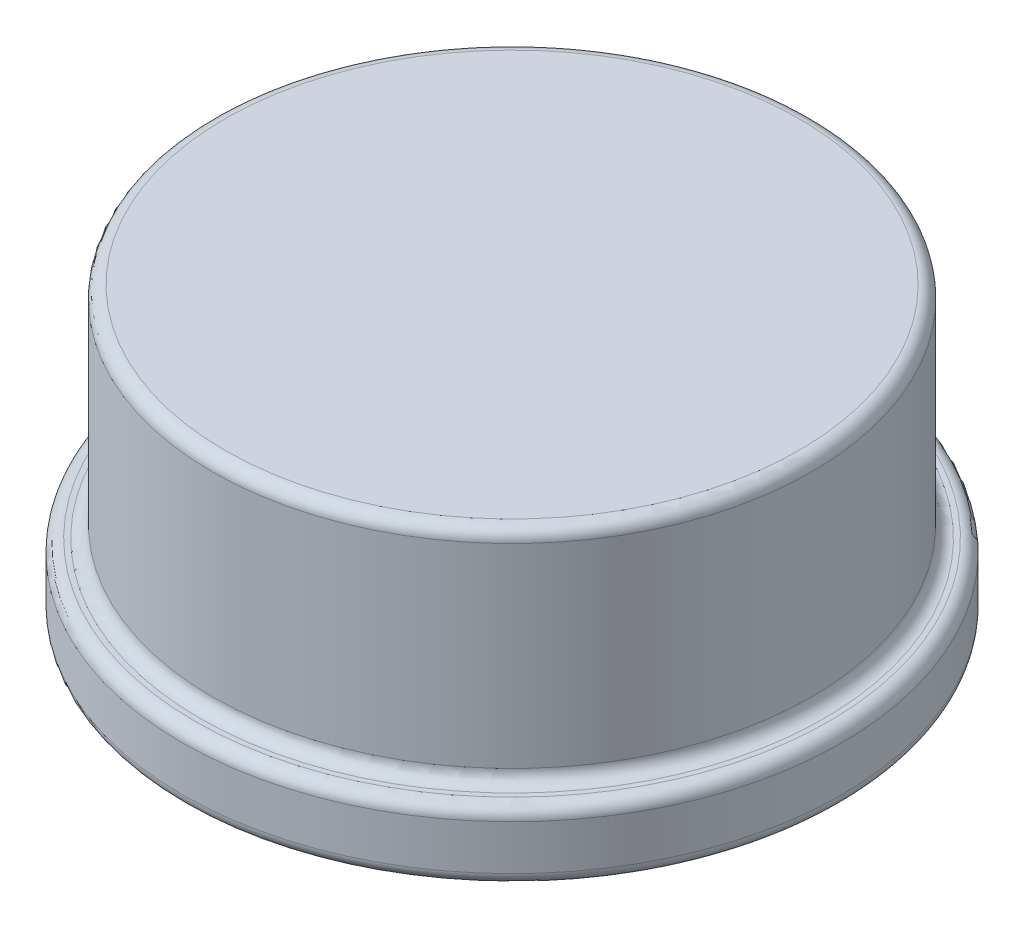
ISO-10303-21;
HEADER;
FILE_DESCRIPTION(('STEP AP214'),'2;1');
FILE_NAME('part.step','',(''),(''),'','','');
FILE_SCHEMA(('AUTOMOTIVE_DESIGN { 1 0 10303 214 1 1 1 1 }'));
ENDSEC;
DATA;
#1=APPLICATION_CONTEXT('core data for automotive mechanical design processes');
#2=APPLICATION_PROTOCOL_DEFINITION('international standard','automotive_design',2000,#1);
#3=PRODUCT_CONTEXT('',#1,'mechanical');
#4=PRODUCT('Part','Part','',(#3));
#5=PRODUCT_RELATED_PRODUCT_CATEGORY('part','',(#4));
#6=PRODUCT_DEFINITION_FORMATION('','',#4);
#7=PRODUCT_DEFINITION_CONTEXT('part definition',#1,'design');
#8=PRODUCT_DEFINITION('design','',#6,#7);
#9=PRODUCT_DEFINITION_SHAPE('','',#8);
#10=(LENGTH_UNIT() NAMED_UNIT(*) SI_UNIT(.MILLI.,.METRE.));
#11=(NAMED_UNIT(*) PLANE_ANGLE_UNIT() SI_UNIT($,.RADIAN.));
#12=(NAMED_UNIT(*) SI_UNIT($,.STERADIAN.) SOLID_ANGLE_UNIT());
#13=UNCERTAINTY_MEASURE_WITH_UNIT(LENGTH_MEASURE(1.E-05),#10,'distance_accuracy_value','');
#14=(GEOMETRIC_REPRESENTATION_CONTEXT(3) GLOBAL_UNCERTAINTY_ASSIGNED_CONTEXT((#13)) GLOBAL_UNIT_ASSIGNED_CONTEXT((#10,
#11,#12)) REPRESENTATION_CONTEXT('',''));
#15=CARTESIAN_POINT('',(0.,0.,0.));
#16=DIRECTION('',(0.,0.,1.));
#17=DIRECTION('',(1.,0.,0.));
#18=AXIS2_PLACEMENT_3D('',#15,#16,#17);
#19=CARTESIAN_POINT('',(0.,1.06415094339623,0.));
#20=DIRECTION('',(0.,-1.,0.));
#21=DIRECTION('',(0.,0.,-1.));
#22=AXIS2_PLACEMENT_3D('',#19,#20,#21);
#23=PLANE('',#22);
#24=CARTESIAN_POINT('',(0.,1.06415094339623,0.));
#25=DIRECTION('',(0.,1.,0.));
#26=DIRECTION('',(0.,0.,1.));
#27=AXIS2_PLACEMENT_3D('',#24,#25,#26);
#28=CIRCLE('',#27,4.75);
#29=CARTESIAN_POINT('',(0.,1.06415094339623,4.75));
#30=VERTEX_POINT('',#29);
#31=EDGE_CURVE('E10',#30,#30,#28,.T.);
#32=ORIENTED_EDGE('',*,*,#31,.F.);
#33=EDGE_LOOP('',(#32));
#34=FACE_BOUND('',#33,.T.);
#35=ADVANCED_FACE('F31',(#34),#23,.T.);
#36=CARTESIAN_POINT('',(0.,0.814150943396227,0.));
#37=DIRECTION('',(0.,1.,0.));
#38=DIRECTION('',(0.,0.,1.));
#39=AXIS2_PLACEMENT_3D('',#36,#37,#38);
#40=TOROIDAL_SURFACE('',#39,4.75,0.25);
#41=ORIENTED_EDGE('',*,*,#31,.T.);
#42=EDGE_LOOP('',(#41));
#43=FACE_BOUND('',#42,.T.);
#44=CARTESIAN_POINT('',(0.,0.814150943396225,0.));
#45=DIRECTION('',(0.,1.,0.));
#46=DIRECTION('',(0.,0.,1.));
#47=AXIS2_PLACEMENT_3D('',#44,#45,#46);
#48=CIRCLE('',#47,5.);
#49=CARTESIAN_POINT('',(0.,0.814150943396225,5.));
#50=VERTEX_POINT('',#49);
#51=EDGE_CURVE('E37',#50,#50,#48,.T.);
#52=ORIENTED_EDGE('',*,*,#51,.F.);
#53=EDGE_LOOP('',(#52));
#54=FACE_BOUND('',#53,.T.);
#55=ADVANCED_FACE('F91',(#43,#54),#40,.F.);
#56=CARTESIAN_POINT('',(0.,13.8679245283019,0.));
#57=DIRECTION('',(0.,1.,0.));
#58=DIRECTION('',(0.,0.,1.));
#59=AXIS2_PLACEMENT_3D('',#56,#57,#58);
#60=CYLINDRICAL_SURFACE('',#59,5.);
#61=ORIENTED_EDGE('',*,*,#51,.T.);
#62=EDGE_LOOP('',(#61));
#63=FACE_BOUND('',#62,.T.);
#64=CARTESIAN_POINT('',(0.,-3.48584905660377,0.));
#65=DIRECTION('',(0.,1.,0.));
#66=DIRECTION('',(0.,0.,1.));
#67=AXIS2_PLACEMENT_3D('',#64,#65,#66);
#68=CIRCLE('',#67,5.);
#69=CARTESIAN_POINT('',(0.,-3.48584905660377,5.));
#70=VERTEX_POINT('',#69);
#71=EDGE_CURVE('E41',#70,#70,#68,.T.);
#72=ORIENTED_EDGE('',*,*,#71,.F.);
#73=EDGE_LOOP('',(#72));
#74=FACE_BOUND('',#73,.T.);
#75=ADVANCED_FACE('F96',(#63,#74),#60,.F.);
#76=CARTESIAN_POINT('',(0.,-3.48584905660377,0.));
#77=DIRECTION('',(0.,1.,0.));
#78=DIRECTION('',(0.,0.,1.));
#79=AXIS2_PLACEMENT_3D('',#76,#77,#78);
#80=TOROIDAL_SURFACE('',#79,5.25,0.25);
#81=ORIENTED_EDGE('',*,*,#71,.T.);
#82=EDGE_LOOP('',(#81));
#83=FACE_BOUND('',#82,.T.);
#84=CARTESIAN_POINT('',(0.,-3.73584905660377,0.));
#85=DIRECTION('',(0.,1.,0.));
#86=DIRECTION('',(0.,0.,1.));
#87=AXIS2_PLACEMENT_3D('',#84,#85,#86);
#88=CIRCLE('',#87,5.25);
#89=CARTESIAN_POINT('',(0.,-3.73584905660377,5.25));
#90=VERTEX_POINT('',#89);
#91=EDGE_CURVE('E45',#90,#90,#88,.T.);
#92=ORIENTED_EDGE('',*,*,#91,.F.);
#93=EDGE_LOOP('',(#92));
#94=FACE_BOUND('',#93,.T.);
#95=ADVANCED_FACE('F100',(#83,#94),#80,.T.);
#96=CARTESIAN_POINT('',(0.,-3.73584905660377,5.25));
#97=DIRECTION('',(0.,-1.,0.));
#98=DIRECTION('',(0.,0.,-1.));
#99=AXIS2_PLACEMENT_3D('',#96,#97,#98);
#100=PLANE('',#99);
#101=ORIENTED_EDGE('',*,*,#91,.T.);
#102=EDGE_LOOP('',(#101));
#103=FACE_BOUND('',#102,.T.);
#104=CARTESIAN_POINT('',(0.,-3.73584905660377,0.));
#105=DIRECTION('',(0.,1.,0.));
#106=DIRECTION('',(0.,0.,1.));
#107=AXIS2_PLACEMENT_3D('',#104,#105,#106);
#108=CIRCLE('',#107,6.35);
#109=CARTESIAN_POINT('',(0.,-3.73584905660377,6.35));
#110=VERTEX_POINT('',#109);
#111=EDGE_CURVE('E50',#110,#110,#108,.T.);
#112=ORIENTED_EDGE('',*,*,#111,.F.);
#113=EDGE_LOOP('',(#112));
#114=FACE_BOUND('',#113,.T.);
#115=ADVANCED_FACE('F106',(#103,#114),#100,.T.);
#116=CARTESIAN_POINT('',(0.,-3.48584905660377,0.));
#117=DIRECTION('',(0.,1.,0.));
#118=DIRECTION('',(0.,0.,1.));
#119=AXIS2_PLACEMENT_3D('',#116,#117,#118);
#120=TOROIDAL_SURFACE('',#119,6.35,0.25);
#121=ORIENTED_EDGE('',*,*,#111,.T.);
#122=EDGE_LOOP('',(#121));
#123=FACE_BOUND('',#122,.T.);
#124=CARTESIAN_POINT('',(0.,-3.48584905660377,0.));
#125=DIRECTION('',(0.,1.,0.));
#126=DIRECTION('',(0.,0.,1.));
#127=AXIS2_PLACEMENT_3D('',#124,#125,#126);
#128=CIRCLE('',#127,6.6);
#129=CARTESIAN_POINT('',(0.,-3.48584905660377,6.6));
#130=VERTEX_POINT('',#129);
#131=EDGE_CURVE('E53',#130,#130,#128,.T.);
#132=ORIENTED_EDGE('',*,*,#131,.F.);
#133=EDGE_LOOP('',(#132));
#134=FACE_BOUND('',#133,.T.);
#135=ADVANCED_FACE('F110',(#123,#134),#120,.T.);
#136=CARTESIAN_POINT('',(0.,13.8679245283019,0.));
#137=DIRECTION('',(0.,1.,0.));
#138=DIRECTION('',(0.,0.,1.));
#139=AXIS2_PLACEMENT_3D('',#136,#137,#138);
#140=CYLINDRICAL_SURFACE('',#139,6.6);
#141=ORIENTED_EDGE('',*,*,#131,.T.);
#142=EDGE_LOOP('',(#141));
#143=FACE_BOUND('',#142,.T.);
#144=CARTESIAN_POINT('',(0.,-2.58584905660378,0.));
#145=DIRECTION('',(0.,1.,0.));
#146=DIRECTION('',(0.,0.,1.));
#147=AXIS2_PLACEMENT_3D('',#144,#145,#146);
#148=CIRCLE('',#147,6.6);
#149=CARTESIAN_POINT('',(0.,-2.58584905660378,6.6));
#150=VERTEX_POINT('',#149);
#151=EDGE_CURVE('E56',#150,#150,#148,.T.);
#152=ORIENTED_EDGE('',*,*,#151,.F.);
#153=EDGE_LOOP('',(#152));
#154=FACE_BOUND('',#153,.T.);
#155=ADVANCED_FACE('F114',(#143,#154),#140,.T.);
#156=CARTESIAN_POINT('',(0.,-2.58584905660377,0.));
#157=DIRECTION('',(0.,1.,0.));
#158=DIRECTION('',(0.,0.,1.));
#159=AXIS2_PLACEMENT_3D('',#156,#157,#158);
#160=TOROIDAL_SURFACE('',#159,6.35,0.25);
#161=ORIENTED_EDGE('',*,*,#151,.T.);
#162=EDGE_LOOP('',(#161));
#163=FACE_BOUND('',#162,.T.);
#164=CARTESIAN_POINT('',(0.,-2.33584905660377,0.));
#165=DIRECTION('',(0.,1.,0.));
#166=DIRECTION('',(0.,0.,1.));
#167=AXIS2_PLACEMENT_3D('',#164,#165,#166);
#168=CIRCLE('',#167,6.35);
#169=CARTESIAN_POINT('',(0.,-2.33584905660377,6.35));
#170=VERTEX_POINT('',#169);
#171=EDGE_CURVE('E59',#170,#170,#168,.T.);
#172=ORIENTED_EDGE('',*,*,#171,.F.);
#173=EDGE_LOOP('',(#172));
#174=FACE_BOUND('',#173,.T.);
#175=ADVANCED_FACE('F118',(#163,#174),#160,.T.);
#176=CARTESIAN_POINT('',(0.,-2.33584905660377,6.25));
#177=DIRECTION('',(0.,1.,0.));
#178=DIRECTION('',(0.,0.,1.));
#179=AXIS2_PLACEMENT_3D('',#176,#177,#178);
#180=PLANE('',#179);
#181=ORIENTED_EDGE('',*,*,#171,.T.);
#182=EDGE_LOOP('',(#181));
#183=FACE_BOUND('',#182,.T.);
#184=CARTESIAN_POINT('',(0.,-2.33584905660377,0.));
#185=DIRECTION('',(0.,1.,0.));
#186=DIRECTION('',(0.,0.,1.));
#187=AXIS2_PLACEMENT_3D('',#184,#185,#186);
#188=CIRCLE('',#187,6.25);
#189=CARTESIAN_POINT('',(0.,-2.33584905660377,6.25));
#190=VERTEX_POINT('',#189);
#191=EDGE_CURVE('E62',#190,#190,#188,.T.);
#192=ORIENTED_EDGE('',*,*,#191,.F.);
#193=EDGE_LOOP('',(#192));
#194=FACE_BOUND('',#193,.T.);
#195=ADVANCED_FACE('F122',(#183,#194),#180,.T.);
#196=CARTESIAN_POINT('',(0.,-2.08584905660377,0.));
#197=DIRECTION('',(0.,1.,0.));
#198=DIRECTION('',(0.,0.,1.));
#199=AXIS2_PLACEMENT_3D('',#196,#197,#198);
#200=TOROIDAL_SURFACE('',#199,6.25,0.25);
#201=ORIENTED_EDGE('',*,*,#191,.T.);
#202=EDGE_LOOP('',(#201));
#203=FACE_BOUND('',#202,.T.);
#204=CARTESIAN_POINT('',(0.,-2.08584905660377,0.));
#205=DIRECTION('',(0.,1.,0.));
#206=DIRECTION('',(0.,0.,1.));
#207=AXIS2_PLACEMENT_3D('',#204,#205,#206);
#208=CIRCLE('',#207,6.);
#209=CARTESIAN_POINT('',(0.,-2.08584905660377,6.));
#210=VERTEX_POINT('',#209);
#211=EDGE_CURVE('E65',#210,#210,#208,.T.);
#212=ORIENTED_EDGE('',*,*,#211,.F.);
#213=EDGE_LOOP('',(#212));
#214=FACE_BOUND('',#213,.T.);
#215=ADVANCED_FACE('F87',(#203,#214),#200,.F.);
#216=CARTESIAN_POINT('',(0.,13.8679245283019,0.));
#217=DIRECTION('',(0.,1.,0.));
#218=DIRECTION('',(0.,0.,1.));
#219=AXIS2_PLACEMENT_3D('',#216,#217,#218);
#220=CYLINDRICAL_SURFACE('',#219,6.);
#221=ORIENTED_EDGE('',*,*,#211,.T.);
#222=EDGE_LOOP('',(#221));
#223=FACE_BOUND('',#222,.T.);
#224=CARTESIAN_POINT('',(0.,1.81415094339622,0.));
#225=DIRECTION('',(0.,1.,0.));
#226=DIRECTION('',(0.,0.,1.));
#227=AXIS2_PLACEMENT_3D('',#224,#225,#226);
#228=CIRCLE('',#227,6.);
#229=CARTESIAN_POINT('',(0.,1.81415094339622,6.));
#230=VERTEX_POINT('',#229);
#231=EDGE_CURVE('E68',#230,#230,#228,.T.);
#232=ORIENTED_EDGE('',*,*,#231,.F.);
#233=EDGE_LOOP('',(#232));
#234=FACE_BOUND('',#233,.T.);
#235=ADVANCED_FACE('F79',(#223,#234),#220,.T.);
#236=CARTESIAN_POINT('',(0.,1.81415094339623,0.));
#237=DIRECTION('',(0.,1.,0.));
#238=DIRECTION('',(0.,0.,1.));
#239=AXIS2_PLACEMENT_3D('',#236,#237,#238);
#240=TOROIDAL_SURFACE('',#239,5.75,0.25);
#241=ORIENTED_EDGE('',*,*,#231,.T.);
#242=EDGE_LOOP('',(#241));
#243=FACE_BOUND('',#242,.T.);
#244=CARTESIAN_POINT('',(0.,2.06415094339623,0.));
#245=DIRECTION('',(0.,1.,0.));
#246=DIRECTION('',(0.,0.,1.));
#247=AXIS2_PLACEMENT_3D('',#244,#245,#246);
#248=CIRCLE('',#247,5.75);
#249=CARTESIAN_POINT('',(0.,2.06415094339623,5.75));
#250=VERTEX_POINT('',#249);
#251=EDGE_CURVE('E71',#250,#250,#248,.T.);
#252=ORIENTED_EDGE('',*,*,#251,.F.);
#253=EDGE_LOOP('',(#252));
#254=FACE_BOUND('',#253,.T.);
#255=ADVANCED_FACE('F77',(#243,#254),#240,.T.);
#256=CARTESIAN_POINT('',(0.,2.06415094339623,0.));
#257=DIRECTION('',(0.,1.,0.));
#258=DIRECTION('',(0.,0.,1.));
#259=AXIS2_PLACEMENT_3D('',#256,#257,#258);
#260=PLANE('',#259);
#261=ORIENTED_EDGE('',*,*,#251,.T.);
#262=EDGE_LOOP('',(#261));
#263=FACE_BOUND('',#262,.T.);
#264=ADVANCED_FACE('F75',(#263),#260,.T.);
#265=CLOSED_SHELL('',(#35,#55,#75,#95,#115,#135,#155,#175,#195,#215,#235,#255,#264));
#266=MANIFOLD_SOLID_BREP('B2',#265);
#267=ADVANCED_BREP_SHAPE_REPRESENTATION('',(#18,#266),#14);
#268=SHAPE_DEFINITION_REPRESENTATION(#9,#267);
ENDSEC;
END-ISO-10303-21;
